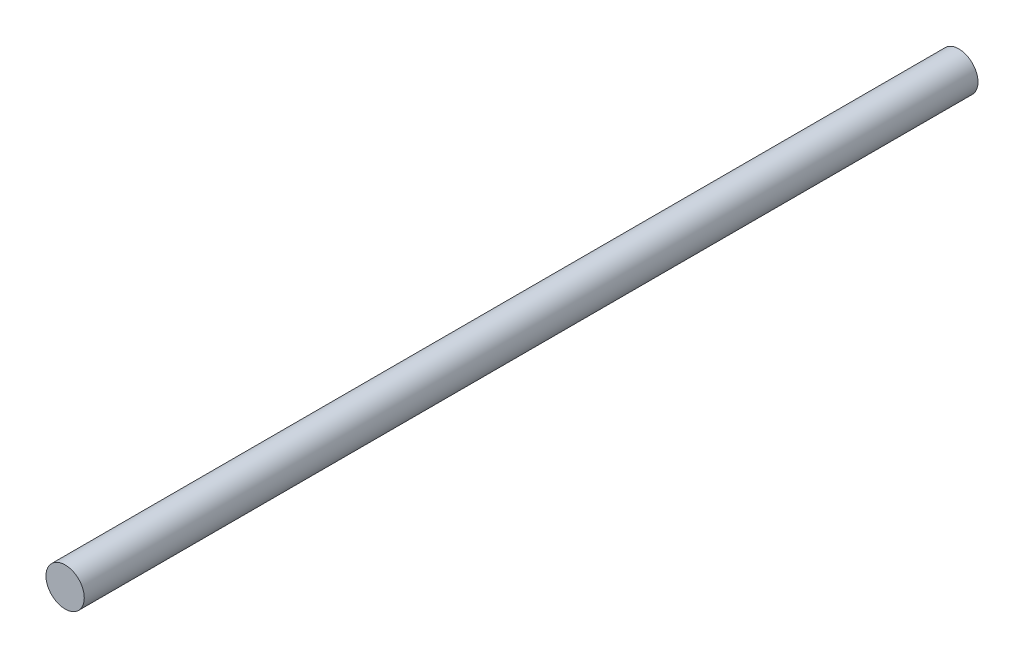
ISO-10303-21;
HEADER;
FILE_DESCRIPTION(('STEP AP214'),'2;1');
FILE_NAME('part.step','',(''),(''),'','','');
FILE_SCHEMA(('AUTOMOTIVE_DESIGN { 1 0 10303 214 1 1 1 1 }'));
ENDSEC;
DATA;
#1=APPLICATION_CONTEXT('core data for automotive mechanical design processes');
#2=APPLICATION_PROTOCOL_DEFINITION('international standard','automotive_design',2000,#1);
#3=PRODUCT_CONTEXT('',#1,'mechanical');
#4=PRODUCT('Part','Part','',(#3));
#5=PRODUCT_RELATED_PRODUCT_CATEGORY('part','',(#4));
#6=PRODUCT_DEFINITION_FORMATION('','',#4);
#7=PRODUCT_DEFINITION_CONTEXT('part definition',#1,'design');
#8=PRODUCT_DEFINITION('design','',#6,#7);
#9=PRODUCT_DEFINITION_SHAPE('','',#8);
#10=(LENGTH_UNIT() NAMED_UNIT(*) SI_UNIT(.MILLI.,.METRE.));
#11=(NAMED_UNIT(*) PLANE_ANGLE_UNIT() SI_UNIT($,.RADIAN.));
#12=(NAMED_UNIT(*) SI_UNIT($,.STERADIAN.) SOLID_ANGLE_UNIT());
#13=UNCERTAINTY_MEASURE_WITH_UNIT(LENGTH_MEASURE(1.E-05),#10,'distance_accuracy_value','');
#14=(GEOMETRIC_REPRESENTATION_CONTEXT(3) GLOBAL_UNCERTAINTY_ASSIGNED_CONTEXT((#13)) GLOBAL_UNIT_ASSIGNED_CONTEXT((#10,
#11,#12)) REPRESENTATION_CONTEXT('',''));
#15=CARTESIAN_POINT('',(0.,0.,0.));
#16=DIRECTION('',(0.,0.,1.));
#17=DIRECTION('',(1.,0.,0.));
#18=AXIS2_PLACEMENT_3D('',#15,#16,#17);
#19=CARTESIAN_POINT('',(0.,0.,-350.));
#20=DIRECTION('',(0.,0.,1.));
#21=DIRECTION('',(1.,0.,0.));
#22=AXIS2_PLACEMENT_3D('',#19,#20,#21);
#23=CYLINDRICAL_SURFACE('',#22,7.5);
#24=CARTESIAN_POINT('',(0.,0.,-350.));
#25=DIRECTION('',(0.,0.,1.));
#26=DIRECTION('',(1.,0.,0.));
#27=AXIS2_PLACEMENT_3D('',#24,#25,#26);
#28=CIRCLE('',#27,7.5);
#29=CARTESIAN_POINT('',(7.5,0.,-350.));
#30=VERTEX_POINT('',#29);
#31=EDGE_CURVE('E10',#30,#30,#28,.T.);
#32=ORIENTED_EDGE('',*,*,#31,.T.);
#33=EDGE_LOOP('',(#32));
#34=FACE_BOUND('',#33,.T.);
#35=CARTESIAN_POINT('',(0.,0.,0.));
#36=DIRECTION('',(0.,0.,1.));
#37=DIRECTION('',(1.,0.,0.));
#38=AXIS2_PLACEMENT_3D('',#35,#36,#37);
#39=CIRCLE('',#38,7.5);
#40=CARTESIAN_POINT('',(7.5,0.,0.));
#41=VERTEX_POINT('',#40);
#42=EDGE_CURVE('E42',#41,#41,#39,.T.);
#43=ORIENTED_EDGE('',*,*,#42,.F.);
#44=EDGE_LOOP('',(#43));
#45=FACE_BOUND('',#44,.T.);
#46=ADVANCED_FACE('F39',(#34,#45),#23,.T.);
#47=CARTESIAN_POINT('',(0.,0.,-350.));
#48=DIRECTION('',(0.,0.,1.));
#49=DIRECTION('',(1.,0.,0.));
#50=AXIS2_PLACEMENT_3D('',#47,#48,#49);
#51=PLANE('',#50);
#52=ORIENTED_EDGE('',*,*,#31,.F.);
#53=EDGE_LOOP('',(#52));
#54=FACE_BOUND('',#53,.T.);
#55=ADVANCED_FACE('F54',(#54),#51,.F.);
#56=CARTESIAN_POINT('',(0.,0.,0.));
#57=DIRECTION('',(0.,0.,1.));
#58=DIRECTION('',(1.,0.,0.));
#59=AXIS2_PLACEMENT_3D('',#56,#57,#58);
#60=PLANE('',#59);
#61=ORIENTED_EDGE('',*,*,#42,.T.);
#62=EDGE_LOOP('',(#61));
#63=FACE_BOUND('',#62,.T.);
#64=ADVANCED_FACE('F51',(#63),#60,.T.);
#65=CLOSED_SHELL('',(#46,#55,#64));
#66=MANIFOLD_SOLID_BREP('B2',#65);
#67=ADVANCED_BREP_SHAPE_REPRESENTATION('',(#18,#66),#14);
#68=SHAPE_DEFINITION_REPRESENTATION(#9,#67);
ENDSEC;
END-ISO-10303-21;
